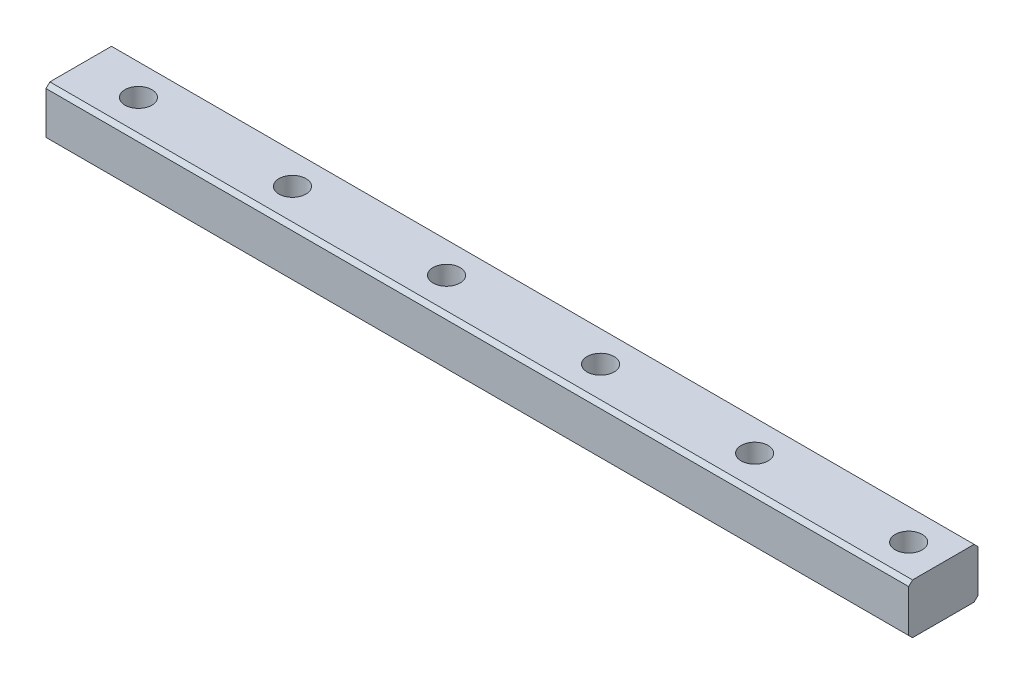
ISO-10303-21;
HEADER;
FILE_DESCRIPTION(('STEP AP214'),'2;1');
FILE_NAME('part.step','',(''),(''),'','','');
FILE_SCHEMA(('AUTOMOTIVE_DESIGN { 1 0 10303 214 1 1 1 1 }'));
ENDSEC;
DATA;
#1=APPLICATION_CONTEXT('core data for automotive mechanical design processes');
#2=APPLICATION_PROTOCOL_DEFINITION('international standard','automotive_design',2000,#1);
#3=PRODUCT_CONTEXT('',#1,'mechanical');
#4=PRODUCT('Part','Part','',(#3));
#5=PRODUCT_RELATED_PRODUCT_CATEGORY('part','',(#4));
#6=PRODUCT_DEFINITION_FORMATION('','',#4);
#7=PRODUCT_DEFINITION_CONTEXT('part definition',#1,'design');
#8=PRODUCT_DEFINITION('design','',#6,#7);
#9=PRODUCT_DEFINITION_SHAPE('','',#8);
#10=(LENGTH_UNIT() NAMED_UNIT(*) SI_UNIT(.MILLI.,.METRE.));
#11=(NAMED_UNIT(*) PLANE_ANGLE_UNIT() SI_UNIT($,.RADIAN.));
#12=(NAMED_UNIT(*) SI_UNIT($,.STERADIAN.) SOLID_ANGLE_UNIT());
#13=UNCERTAINTY_MEASURE_WITH_UNIT(LENGTH_MEASURE(1.E-05),#10,'distance_accuracy_value','');
#14=(GEOMETRIC_REPRESENTATION_CONTEXT(3) GLOBAL_UNCERTAINTY_ASSIGNED_CONTEXT((#13)) GLOBAL_UNIT_ASSIGNED_CONTEXT((#10,
#11,#12)) REPRESENTATION_CONTEXT('',''));
#15=CARTESIAN_POINT('',(0.,0.,0.));
#16=DIRECTION('',(0.,0.,1.));
#17=DIRECTION('',(1.,0.,0.));
#18=AXIS2_PLACEMENT_3D('',#15,#16,#17);
#19=CARTESIAN_POINT('',(107.5,4.75,0.));
#20=DIRECTION('',(0.,-1.,0.));
#21=DIRECTION('',(0.,0.,-1.));
#22=AXIS2_PLACEMENT_3D('',#19,#20,#21);
#23=CYLINDRICAL_SURFACE('',#22,1.75);
#24=CARTESIAN_POINT('',(107.5,3.25,0.));
#25=DIRECTION('',(0.,-1.,0.));
#26=DIRECTION('',(0.,0.,-1.));
#27=AXIS2_PLACEMENT_3D('',#24,#25,#26);
#28=CIRCLE('',#27,1.75);
#29=CARTESIAN_POINT('',(107.5,3.25,-1.75));
#30=VERTEX_POINT('',#29);
#31=EDGE_CURVE('E151',#30,#30,#28,.T.);
#32=ORIENTED_EDGE('',*,*,#31,.F.);
#33=EDGE_LOOP('',(#32));
#34=FACE_BOUND('',#33,.T.);
#35=CARTESIAN_POINT('',(107.5,0.25,0.));
#36=DIRECTION('',(0.,-1.,0.));
#37=DIRECTION('',(0.,0.,-1.));
#38=AXIS2_PLACEMENT_3D('',#35,#36,#37);
#39=CIRCLE('',#38,1.75);
#40=CARTESIAN_POINT('',(107.5,0.25,-1.75));
#41=VERTEX_POINT('',#40);
#42=EDGE_CURVE('E178',#41,#41,#39,.F.);
#43=ORIENTED_EDGE('',*,*,#42,.F.);
#44=EDGE_LOOP('',(#43));
#45=FACE_BOUND('',#44,.T.);
#46=ADVANCED_FACE('F33',(#34,#45),#23,.F.);
#47=CARTESIAN_POINT('',(87.4999999999996,4.75,0.));
#48=DIRECTION('',(0.,-1.,0.));
#49=DIRECTION('',(0.,0.,-1.));
#50=AXIS2_PLACEMENT_3D('',#47,#48,#49);
#51=CYLINDRICAL_SURFACE('',#50,1.75);
#52=CARTESIAN_POINT('',(87.4999999999996,3.25,0.));
#53=DIRECTION('',(0.,-1.,0.));
#54=DIRECTION('',(0.,0.,-1.));
#55=AXIS2_PLACEMENT_3D('',#52,#53,#54);
#56=CIRCLE('',#55,1.75);
#57=CARTESIAN_POINT('',(87.4999999999996,3.25,-1.75));
#58=VERTEX_POINT('',#57);
#59=EDGE_CURVE('E148',#58,#58,#56,.T.);
#60=ORIENTED_EDGE('',*,*,#59,.F.);
#61=EDGE_LOOP('',(#60));
#62=FACE_BOUND('',#61,.T.);
#63=CARTESIAN_POINT('',(87.4999999999996,0.25,0.));
#64=DIRECTION('',(0.,-1.,0.));
#65=DIRECTION('',(0.,0.,-1.));
#66=AXIS2_PLACEMENT_3D('',#63,#64,#65);
#67=CIRCLE('',#66,1.75);
#68=CARTESIAN_POINT('',(87.4999999999996,0.25,-1.75));
#69=VERTEX_POINT('',#68);
#70=EDGE_CURVE('E173',#69,#69,#67,.F.);
#71=ORIENTED_EDGE('',*,*,#70,.F.);
#72=EDGE_LOOP('',(#71));
#73=FACE_BOUND('',#72,.T.);
#74=ADVANCED_FACE('F289',(#62,#73),#51,.F.);
#75=CARTESIAN_POINT('',(67.4999999999997,4.75,0.));
#76=DIRECTION('',(0.,-1.,0.));
#77=DIRECTION('',(0.,0.,-1.));
#78=AXIS2_PLACEMENT_3D('',#75,#76,#77);
#79=CYLINDRICAL_SURFACE('',#78,1.75);
#80=CARTESIAN_POINT('',(67.4999999999997,3.25,0.));
#81=DIRECTION('',(0.,-1.,0.));
#82=DIRECTION('',(0.,0.,-1.));
#83=AXIS2_PLACEMENT_3D('',#80,#81,#82);
#84=CIRCLE('',#83,1.75);
#85=CARTESIAN_POINT('',(67.4999999999997,3.25,-1.75));
#86=VERTEX_POINT('',#85);
#87=EDGE_CURVE('E145',#86,#86,#84,.T.);
#88=ORIENTED_EDGE('',*,*,#87,.F.);
#89=EDGE_LOOP('',(#88));
#90=FACE_BOUND('',#89,.T.);
#91=CARTESIAN_POINT('',(67.4999999999997,0.25,0.));
#92=DIRECTION('',(0.,-1.,0.));
#93=DIRECTION('',(0.,0.,-1.));
#94=AXIS2_PLACEMENT_3D('',#91,#92,#93);
#95=CIRCLE('',#94,1.75);
#96=CARTESIAN_POINT('',(67.4999999999997,0.25,-1.75));
#97=VERTEX_POINT('',#96);
#98=EDGE_CURVE('E168',#97,#97,#95,.F.);
#99=ORIENTED_EDGE('',*,*,#98,.F.);
#100=EDGE_LOOP('',(#99));
#101=FACE_BOUND('',#100,.T.);
#102=ADVANCED_FACE('F294',(#90,#101),#79,.F.);
#103=CARTESIAN_POINT('',(47.4999999999998,4.75,0.));
#104=DIRECTION('',(0.,-1.,0.));
#105=DIRECTION('',(0.,0.,-1.));
#106=AXIS2_PLACEMENT_3D('',#103,#104,#105);
#107=CYLINDRICAL_SURFACE('',#106,1.75);
#108=CARTESIAN_POINT('',(47.4999999999998,3.25,0.));
#109=DIRECTION('',(0.,-1.,0.));
#110=DIRECTION('',(0.,0.,-1.));
#111=AXIS2_PLACEMENT_3D('',#108,#109,#110);
#112=CIRCLE('',#111,1.75);
#113=CARTESIAN_POINT('',(47.4999999999998,3.25,-1.75000000000001));
#114=VERTEX_POINT('',#113);
#115=EDGE_CURVE('E142',#114,#114,#112,.T.);
#116=ORIENTED_EDGE('',*,*,#115,.F.);
#117=EDGE_LOOP('',(#116));
#118=FACE_BOUND('',#117,.T.);
#119=CARTESIAN_POINT('',(47.4999999999998,0.25,0.));
#120=DIRECTION('',(0.,-1.,0.));
#121=DIRECTION('',(0.,0.,-1.));
#122=AXIS2_PLACEMENT_3D('',#119,#120,#121);
#123=CIRCLE('',#122,1.75);
#124=CARTESIAN_POINT('',(47.4999999999998,0.25,-1.75000000000001));
#125=VERTEX_POINT('',#124);
#126=EDGE_CURVE('E163',#125,#125,#123,.F.);
#127=ORIENTED_EDGE('',*,*,#126,.F.);
#128=EDGE_LOOP('',(#127));
#129=FACE_BOUND('',#128,.T.);
#130=ADVANCED_FACE('F302',(#118,#129),#107,.F.);
#131=CARTESIAN_POINT('',(27.4999999999999,4.75,0.));
#132=DIRECTION('',(0.,-1.,0.));
#133=DIRECTION('',(0.,0.,-1.));
#134=AXIS2_PLACEMENT_3D('',#131,#132,#133);
#135=CYLINDRICAL_SURFACE('',#134,1.75);
#136=CARTESIAN_POINT('',(27.4999999999999,3.25,0.));
#137=DIRECTION('',(0.,-1.,0.));
#138=DIRECTION('',(0.,0.,-1.));
#139=AXIS2_PLACEMENT_3D('',#136,#137,#138);
#140=CIRCLE('',#139,1.75);
#141=CARTESIAN_POINT('',(27.4999999999999,3.25,-1.75));
#142=VERTEX_POINT('',#141);
#143=EDGE_CURVE('E139',#142,#142,#140,.T.);
#144=ORIENTED_EDGE('',*,*,#143,.F.);
#145=EDGE_LOOP('',(#144));
#146=FACE_BOUND('',#145,.T.);
#147=CARTESIAN_POINT('',(27.4999999999999,0.25,0.));
#148=DIRECTION('',(0.,-1.,0.));
#149=DIRECTION('',(0.,0.,-1.));
#150=AXIS2_PLACEMENT_3D('',#147,#148,#149);
#151=CIRCLE('',#150,1.75);
#152=CARTESIAN_POINT('',(27.4999999999999,0.25,-1.75));
#153=VERTEX_POINT('',#152);
#154=EDGE_CURVE('E158',#153,#153,#151,.F.);
#155=ORIENTED_EDGE('',*,*,#154,.F.);
#156=EDGE_LOOP('',(#155));
#157=FACE_BOUND('',#156,.T.);
#158=ADVANCED_FACE('F306',(#146,#157),#135,.F.);
#159=CARTESIAN_POINT('',(7.5,4.75,0.));
#160=DIRECTION('',(0.,-1.,0.));
#161=DIRECTION('',(0.,0.,-1.));
#162=AXIS2_PLACEMENT_3D('',#159,#160,#161);
#163=CYLINDRICAL_SURFACE('',#162,1.75);
#164=CARTESIAN_POINT('',(7.5,3.25,0.));
#165=DIRECTION('',(0.,-1.,0.));
#166=DIRECTION('',(0.,0.,-1.));
#167=AXIS2_PLACEMENT_3D('',#164,#165,#166);
#168=CIRCLE('',#167,1.75);
#169=CARTESIAN_POINT('',(7.5,3.25,-1.75));
#170=VERTEX_POINT('',#169);
#171=EDGE_CURVE('E131',#170,#170,#168,.T.);
#172=ORIENTED_EDGE('',*,*,#171,.F.);
#173=EDGE_LOOP('',(#172));
#174=FACE_BOUND('',#173,.T.);
#175=CARTESIAN_POINT('',(7.5,0.25,0.));
#176=DIRECTION('',(0.,-1.,0.));
#177=DIRECTION('',(0.,0.,-1.));
#178=AXIS2_PLACEMENT_3D('',#175,#176,#177);
#179=CIRCLE('',#178,1.75);
#180=CARTESIAN_POINT('',(7.5,0.25,-1.75));
#181=VERTEX_POINT('',#180);
#182=EDGE_CURVE('E154',#181,#181,#179,.F.);
#183=ORIENTED_EDGE('',*,*,#182,.F.);
#184=EDGE_LOOP('',(#183));
#185=FACE_BOUND('',#184,.T.);
#186=ADVANCED_FACE('F310',(#174,#185),#163,.F.);
#187=CARTESIAN_POINT('',(112.,-3.25,4.5));
#188=DIRECTION('',(0.,0.,-1.));
#189=DIRECTION('',(-1.,0.,0.));
#190=AXIS2_PLACEMENT_3D('',#187,#188,#189);
#191=PLANE('',#190);
#192=DIRECTION('',(0.,-1.,0.));
#193=VECTOR('',#192,1.);
#194=CARTESIAN_POINT('',(0.,-3.25,4.5));
#195=LINE('',#194,#193);
#196=CARTESIAN_POINT('',(0.,2.75000000000003,4.5));
#197=VERTEX_POINT('',#196);
#198=CARTESIAN_POINT('',(0.,-2.75,4.5));
#199=VERTEX_POINT('',#198);
#200=EDGE_CURVE('E126',#197,#199,#195,.T.);
#201=ORIENTED_EDGE('',*,*,#200,.T.);
#202=DIRECTION('',(1.,0.,0.));
#203=VECTOR('',#202,1.);
#204=CARTESIAN_POINT('',(112.,-2.75,4.5));
#205=LINE('',#204,#203);
#206=CARTESIAN_POINT('',(112.,-2.75,4.5));
#207=VERTEX_POINT('',#206);
#208=EDGE_CURVE('E104',#199,#207,#205,.T.);
#209=ORIENTED_EDGE('',*,*,#208,.T.);
#210=DIRECTION('',(0.,-1.,0.));
#211=VECTOR('',#210,1.);
#212=CARTESIAN_POINT('',(112.,-3.25,4.5));
#213=LINE('',#212,#211);
#214=CARTESIAN_POINT('',(112.,2.75000000000003,4.5));
#215=VERTEX_POINT('',#214);
#216=EDGE_CURVE('E136',#215,#207,#213,.T.);
#217=ORIENTED_EDGE('',*,*,#216,.F.);
#218=DIRECTION('',(-1.,0.,0.));
#219=VECTOR('',#218,1.);
#220=CARTESIAN_POINT('',(112.,2.75000000000003,4.5));
#221=LINE('',#220,#219);
#222=EDGE_CURVE('E109',#215,#197,#221,.T.);
#223=ORIENTED_EDGE('',*,*,#222,.T.);
#224=EDGE_LOOP('',(#201,#209,#217,#223));
#225=FACE_BOUND('',#224,.T.);
#226=ADVANCED_FACE('F259',(#225),#191,.F.);
#227=CARTESIAN_POINT('',(112.,-3.25,-4.5));
#228=DIRECTION('',(0.,1.,0.));
#229=DIRECTION('',(0.,0.,1.));
#230=AXIS2_PLACEMENT_3D('',#227,#228,#229);
#231=PLANE('',#230);
#232=CARTESIAN_POINT('',(107.5,-3.25,0.));
#233=DIRECTION('',(0.,-1.,0.));
#234=DIRECTION('',(0.,0.,-1.));
#235=AXIS2_PLACEMENT_3D('',#232,#233,#234);
#236=CIRCLE('',#235,2.99999999999999);
#237=CARTESIAN_POINT('',(107.5,-3.25,-2.99999999999999));
#238=VERTEX_POINT('',#237);
#239=EDGE_CURVE('E242',#238,#238,#236,.T.);
#240=ORIENTED_EDGE('',*,*,#239,.F.);
#241=EDGE_LOOP('',(#240));
#242=FACE_BOUND('',#241,.T.);
#243=CARTESIAN_POINT('',(87.5,-3.25,0.));
#244=DIRECTION('',(0.,-1.,0.));
#245=DIRECTION('',(0.,0.,-1.));
#246=AXIS2_PLACEMENT_3D('',#243,#244,#245);
#247=CIRCLE('',#246,3.00000000000001);
#248=CARTESIAN_POINT('',(87.5,-3.25,-3.00000000000001));
#249=VERTEX_POINT('',#248);
#250=EDGE_CURVE('E181',#249,#249,#247,.T.);
#251=ORIENTED_EDGE('',*,*,#250,.F.);
#252=EDGE_LOOP('',(#251));
#253=FACE_BOUND('',#252,.T.);
#254=CARTESIAN_POINT('',(67.5,-3.25,0.));
#255=DIRECTION('',(0.,-1.,0.));
#256=DIRECTION('',(0.,0.,-1.));
#257=AXIS2_PLACEMENT_3D('',#254,#255,#256);
#258=CIRCLE('',#257,2.99999999999999);
#259=CARTESIAN_POINT('',(67.5,-3.25,-2.99999999999999));
#260=VERTEX_POINT('',#259);
#261=EDGE_CURVE('E176',#260,#260,#258,.T.);
#262=ORIENTED_EDGE('',*,*,#261,.F.);
#263=EDGE_LOOP('',(#262));
#264=FACE_BOUND('',#263,.T.);
#265=CARTESIAN_POINT('',(47.5,-3.25,0.));
#266=DIRECTION('',(0.,-1.,0.));
#267=DIRECTION('',(0.,0.,-1.));
#268=AXIS2_PLACEMENT_3D('',#265,#266,#267);
#269=CIRCLE('',#268,3.);
#270=CARTESIAN_POINT('',(47.5,-3.25,-3.));
#271=VERTEX_POINT('',#270);
#272=EDGE_CURVE('E171',#271,#271,#269,.T.);
#273=ORIENTED_EDGE('',*,*,#272,.F.);
#274=EDGE_LOOP('',(#273));
#275=FACE_BOUND('',#274,.T.);
#276=CARTESIAN_POINT('',(27.5,-3.25,0.));
#277=DIRECTION('',(0.,-1.,0.));
#278=DIRECTION('',(0.,0.,-1.));
#279=AXIS2_PLACEMENT_3D('',#276,#277,#278);
#280=CIRCLE('',#279,3.);
#281=CARTESIAN_POINT('',(27.5,-3.25,-3.));
#282=VERTEX_POINT('',#281);
#283=EDGE_CURVE('E166',#282,#282,#280,.T.);
#284=ORIENTED_EDGE('',*,*,#283,.F.);
#285=EDGE_LOOP('',(#284));
#286=FACE_BOUND('',#285,.T.);
#287=CARTESIAN_POINT('',(7.5,-3.25,0.));
#288=DIRECTION('',(0.,-1.,0.));
#289=DIRECTION('',(0.,0.,-1.));
#290=AXIS2_PLACEMENT_3D('',#287,#288,#289);
#291=CIRCLE('',#290,3.);
#292=CARTESIAN_POINT('',(7.5,-3.25,-3.));
#293=VERTEX_POINT('',#292);
#294=EDGE_CURVE('E161',#293,#293,#291,.T.);
#295=ORIENTED_EDGE('',*,*,#294,.F.);
#296=EDGE_LOOP('',(#295));
#297=FACE_BOUND('',#296,.T.);
#298=DIRECTION('',(0.,0.,-1.));
#299=VECTOR('',#298,1.);
#300=CARTESIAN_POINT('',(112.,-3.25,-4.5));
#301=LINE('',#300,#299);
#302=CARTESIAN_POINT('',(112.,-3.25,4.00000000000001));
#303=VERTEX_POINT('',#302);
#304=CARTESIAN_POINT('',(112.,-3.25,-4.));
#305=VERTEX_POINT('',#304);
#306=EDGE_CURVE('E119',#303,#305,#301,.T.);
#307=ORIENTED_EDGE('',*,*,#306,.F.);
#308=DIRECTION('',(-1.,0.,0.));
#309=VECTOR('',#308,1.);
#310=CARTESIAN_POINT('',(112.,-3.25,4.00000000000001));
#311=LINE('',#310,#309);
#312=CARTESIAN_POINT('',(0.,-3.25,4.00000000000001));
#313=VERTEX_POINT('',#312);
#314=EDGE_CURVE('E103',#303,#313,#311,.T.);
#315=ORIENTED_EDGE('',*,*,#314,.T.);
#316=DIRECTION('',(0.,0.,-1.));
#317=VECTOR('',#316,1.);
#318=CARTESIAN_POINT('',(0.,-3.25,-4.5));
#319=LINE('',#318,#317);
#320=CARTESIAN_POINT('',(0.,-3.25,-4.));
#321=VERTEX_POINT('',#320);
#322=EDGE_CURVE('E116',#313,#321,#319,.T.);
#323=ORIENTED_EDGE('',*,*,#322,.T.);
#324=DIRECTION('',(1.,0.,0.));
#325=VECTOR('',#324,1.);
#326=CARTESIAN_POINT('',(112.,-3.25,-4.));
#327=LINE('',#326,#325);
#328=EDGE_CURVE('E121',#321,#305,#327,.T.);
#329=ORIENTED_EDGE('',*,*,#328,.T.);
#330=EDGE_LOOP('',(#307,#315,#323,#329));
#331=FACE_BOUND('',#330,.T.);
#332=ADVANCED_FACE('F115',(#242,#253,#264,#275,#286,#297,#331),#231,.F.);
#333=CARTESIAN_POINT('',(112.,-3.25,-4.5));
#334=DIRECTION('',(0.,0.,1.));
#335=DIRECTION('',(1.,0.,0.));
#336=AXIS2_PLACEMENT_3D('',#333,#334,#335);
#337=PLANE('',#336);
#338=DIRECTION('',(0.,1.,0.));
#339=VECTOR('',#338,1.);
#340=CARTESIAN_POINT('',(0.,-3.25,-4.5));
#341=LINE('',#340,#339);
#342=CARTESIAN_POINT('',(0.,-2.75000000000001,-4.5));
#343=VERTEX_POINT('',#342);
#344=CARTESIAN_POINT('',(0.,2.75,-4.5));
#345=VERTEX_POINT('',#344);
#346=EDGE_CURVE('E125',#343,#345,#341,.T.);
#347=ORIENTED_EDGE('',*,*,#346,.T.);
#348=DIRECTION('',(1.,0.,0.));
#349=VECTOR('',#348,1.);
#350=CARTESIAN_POINT('',(112.,2.75,-4.5));
#351=LINE('',#350,#349);
#352=CARTESIAN_POINT('',(112.,2.75,-4.5));
#353=VERTEX_POINT('',#352);
#354=EDGE_CURVE('E11',#345,#353,#351,.T.);
#355=ORIENTED_EDGE('',*,*,#354,.T.);
#356=DIRECTION('',(0.,1.,0.));
#357=VECTOR('',#356,1.);
#358=CARTESIAN_POINT('',(112.,-3.25,-4.5));
#359=LINE('',#358,#357);
#360=CARTESIAN_POINT('',(112.,-2.75000000000001,-4.5));
#361=VERTEX_POINT('',#360);
#362=EDGE_CURVE('E208',#361,#353,#359,.T.);
#363=ORIENTED_EDGE('',*,*,#362,.F.);
#364=DIRECTION('',(-1.,0.,0.));
#365=VECTOR('',#364,1.);
#366=CARTESIAN_POINT('',(112.,-2.75000000000001,-4.5));
#367=LINE('',#366,#365);
#368=EDGE_CURVE('E41',#361,#343,#367,.T.);
#369=ORIENTED_EDGE('',*,*,#368,.T.);
#370=EDGE_LOOP('',(#347,#355,#363,#369));
#371=FACE_BOUND('',#370,.T.);
#372=ADVANCED_FACE('F206',(#371),#337,.F.);
#373=CARTESIAN_POINT('',(112.,3.25,-4.5));
#374=DIRECTION('',(0.,-1.,0.));
#375=DIRECTION('',(0.,0.,-1.));
#376=AXIS2_PLACEMENT_3D('',#373,#374,#375);
#377=PLANE('',#376);
#378=ORIENTED_EDGE('',*,*,#31,.T.);
#379=EDGE_LOOP('',(#378));
#380=FACE_BOUND('',#379,.T.);
#381=ORIENTED_EDGE('',*,*,#59,.T.);
#382=EDGE_LOOP('',(#381));
#383=FACE_BOUND('',#382,.T.);
#384=ORIENTED_EDGE('',*,*,#87,.T.);
#385=EDGE_LOOP('',(#384));
#386=FACE_BOUND('',#385,.T.);
#387=ORIENTED_EDGE('',*,*,#115,.T.);
#388=EDGE_LOOP('',(#387));
#389=FACE_BOUND('',#388,.T.);
#390=ORIENTED_EDGE('',*,*,#143,.T.);
#391=EDGE_LOOP('',(#390));
#392=FACE_BOUND('',#391,.T.);
#393=ORIENTED_EDGE('',*,*,#171,.T.);
#394=EDGE_LOOP('',(#393));
#395=FACE_BOUND('',#394,.T.);
#396=DIRECTION('',(0.,0.,1.));
#397=VECTOR('',#396,1.);
#398=CARTESIAN_POINT('',(0.,3.25,-4.5));
#399=LINE('',#398,#397);
#400=CARTESIAN_POINT('',(0.,3.25,-4.00000000000001));
#401=VERTEX_POINT('',#400);
#402=CARTESIAN_POINT('',(0.,3.25,4.00000000000003));
#403=VERTEX_POINT('',#402);
#404=EDGE_CURVE('E129',#401,#403,#399,.T.);
#405=ORIENTED_EDGE('',*,*,#404,.T.);
#406=DIRECTION('',(1.,0.,0.));
#407=VECTOR('',#406,1.);
#408=CARTESIAN_POINT('',(112.,3.25,4.00000000000003));
#409=LINE('',#408,#407);
#410=CARTESIAN_POINT('',(112.,3.25,4.00000000000003));
#411=VERTEX_POINT('',#410);
#412=EDGE_CURVE('E48',#403,#411,#409,.T.);
#413=ORIENTED_EDGE('',*,*,#412,.T.);
#414=DIRECTION('',(0.,0.,1.));
#415=VECTOR('',#414,1.);
#416=CARTESIAN_POINT('',(112.,3.25,-4.5));
#417=LINE('',#416,#415);
#418=CARTESIAN_POINT('',(112.,3.25,-4.00000000000001));
#419=VERTEX_POINT('',#418);
#420=EDGE_CURVE('E183',#419,#411,#417,.T.);
#421=ORIENTED_EDGE('',*,*,#420,.F.);
#422=DIRECTION('',(-1.,0.,0.));
#423=VECTOR('',#422,1.);
#424=CARTESIAN_POINT('',(112.,3.25,-4.00000000000001));
#425=LINE('',#424,#423);
#426=EDGE_CURVE('E199',#419,#401,#425,.T.);
#427=ORIENTED_EDGE('',*,*,#426,.T.);
#428=EDGE_LOOP('',(#405,#413,#421,#427));
#429=FACE_BOUND('',#428,.T.);
#430=ADVANCED_FACE('F215',(#380,#383,#386,#389,#392,#395,#429),#377,.F.);
#431=CARTESIAN_POINT('',(112.,3.25,4.5));
#432=DIRECTION('',(1.,0.,0.));
#433=DIRECTION('',(0.,0.,-1.));
#434=AXIS2_PLACEMENT_3D('',#431,#432,#433);
#435=PLANE('',#434);
#436=ORIENTED_EDGE('',*,*,#216,.T.);
#437=DIRECTION('',(0.,0.707106781186557,0.707106781186538));
#438=VECTOR('',#437,1.);
#439=CARTESIAN_POINT('',(112.,0.250000000000082,7.5));
#440=LINE('',#439,#438);
#441=EDGE_CURVE('E197',#207,#303,#440,.F.);
#442=ORIENTED_EDGE('',*,*,#441,.T.);
#443=ORIENTED_EDGE('',*,*,#306,.T.);
#444=DIRECTION('',(0.,-0.707106781186538,0.707106781186557));
#445=VECTOR('',#444,1.);
#446=CARTESIAN_POINT('',(112.,-4.25000000000009,-2.99999999999988));
#447=LINE('',#446,#445);
#448=EDGE_CURVE('E192',#305,#361,#447,.F.);
#449=ORIENTED_EDGE('',*,*,#448,.T.);
#450=ORIENTED_EDGE('',*,*,#362,.T.);
#451=DIRECTION('',(0.,-0.707106781186557,-0.707106781186538));
#452=VECTOR('',#451,1.);
#453=CARTESIAN_POINT('',(112.,7.50000000000001,0.249999999999874));
#454=LINE('',#453,#452);
#455=EDGE_CURVE('E55',#353,#419,#454,.F.);
#456=ORIENTED_EDGE('',*,*,#455,.T.);
#457=ORIENTED_EDGE('',*,*,#420,.T.);
#458=DIRECTION('',(0.,0.707106781186548,-0.707106781186548));
#459=VECTOR('',#458,1.);
#460=CARTESIAN_POINT('',(112.,3.00000000000001,4.25000000000001));
#461=LINE('',#460,#459);
#462=EDGE_CURVE('E195',#411,#215,#461,.F.);
#463=ORIENTED_EDGE('',*,*,#462,.T.);
#464=EDGE_LOOP('',(#436,#442,#443,#449,#450,#456,#457,#463));
#465=FACE_BOUND('',#464,.T.);
#466=ADVANCED_FACE('F315',(#465),#435,.T.);
#467=CARTESIAN_POINT('',(0.,3.25,4.5));
#468=DIRECTION('',(1.,0.,0.));
#469=DIRECTION('',(0.,0.,-1.));
#470=AXIS2_PLACEMENT_3D('',#467,#468,#469);
#471=PLANE('',#470);
#472=ORIENTED_EDGE('',*,*,#322,.F.);
#473=DIRECTION('',(0.,-0.707106781186557,-0.707106781186538));
#474=VECTOR('',#473,1.);
#475=CARTESIAN_POINT('',(0.,-3.25,4.00000000000001));
#476=LINE('',#475,#474);
#477=EDGE_CURVE('E99',#313,#199,#476,.F.);
#478=ORIENTED_EDGE('',*,*,#477,.T.);
#479=ORIENTED_EDGE('',*,*,#200,.F.);
#480=DIRECTION('',(0.,-0.707106781186548,0.707106781186548));
#481=VECTOR('',#480,1.);
#482=CARTESIAN_POINT('',(0.,2.75000000000003,4.5));
#483=LINE('',#482,#481);
#484=EDGE_CURVE('E110',#197,#403,#483,.F.);
#485=ORIENTED_EDGE('',*,*,#484,.T.);
#486=ORIENTED_EDGE('',*,*,#404,.F.);
#487=DIRECTION('',(0.,0.707106781186557,0.707106781186538));
#488=VECTOR('',#487,1.);
#489=CARTESIAN_POINT('',(0.,3.25,-4.00000000000001));
#490=LINE('',#489,#488);
#491=EDGE_CURVE('E186',#401,#345,#490,.F.);
#492=ORIENTED_EDGE('',*,*,#491,.T.);
#493=ORIENTED_EDGE('',*,*,#346,.F.);
#494=DIRECTION('',(0.,0.707106781186538,-0.707106781186557));
#495=VECTOR('',#494,1.);
#496=CARTESIAN_POINT('',(0.,-2.75000000000001,-4.5));
#497=LINE('',#496,#495);
#498=EDGE_CURVE('E120',#343,#321,#497,.F.);
#499=ORIENTED_EDGE('',*,*,#498,.T.);
#500=EDGE_LOOP('',(#472,#478,#479,#485,#486,#492,#493,#499));
#501=FACE_BOUND('',#500,.T.);
#502=ADVANCED_FACE('F123',(#501),#471,.F.);
#503=CARTESIAN_POINT('',(7.5,0.250000000000001,0.));
#504=DIRECTION('',(0.,-1.,0.));
#505=DIRECTION('',(0.,0.,-1.));
#506=AXIS2_PLACEMENT_3D('',#503,#504,#505);
#507=PLANE('',#506);
#508=CARTESIAN_POINT('',(7.5,0.250000000000001,0.));
#509=DIRECTION('',(0.,-1.,0.));
#510=DIRECTION('',(0.,0.,-1.));
#511=AXIS2_PLACEMENT_3D('',#508,#509,#510);
#512=CIRCLE('',#511,3.);
#513=CARTESIAN_POINT('',(7.5,0.25,-3.));
#514=VERTEX_POINT('',#513);
#515=EDGE_CURVE('E157',#514,#514,#512,.T.);
#516=ORIENTED_EDGE('',*,*,#515,.T.);
#517=EDGE_LOOP('',(#516));
#518=FACE_BOUND('',#517,.T.);
#519=ORIENTED_EDGE('',*,*,#182,.T.);
#520=EDGE_LOOP('',(#519));
#521=FACE_BOUND('',#520,.T.);
#522=ADVANCED_FACE('F274',(#518,#521),#507,.T.);
#523=CARTESIAN_POINT('',(7.5,0.250000000000001,0.));
#524=DIRECTION('',(0.,-1.,0.));
#525=DIRECTION('',(0.,0.,-1.));
#526=AXIS2_PLACEMENT_3D('',#523,#524,#525);
#527=CYLINDRICAL_SURFACE('',#526,3.);
#528=ORIENTED_EDGE('',*,*,#515,.F.);
#529=EDGE_LOOP('',(#528));
#530=FACE_BOUND('',#529,.T.);
#531=ORIENTED_EDGE('',*,*,#294,.T.);
#532=EDGE_LOOP('',(#531));
#533=FACE_BOUND('',#532,.T.);
#534=ADVANCED_FACE('F271',(#530,#533),#527,.F.);
#535=CARTESIAN_POINT('',(27.5,0.250000000000001,0.));
#536=DIRECTION('',(0.,-1.,0.));
#537=DIRECTION('',(0.,0.,-1.));
#538=AXIS2_PLACEMENT_3D('',#535,#536,#537);
#539=PLANE('',#538);
#540=CARTESIAN_POINT('',(27.5,0.250000000000001,0.));
#541=DIRECTION('',(0.,-1.,0.));
#542=DIRECTION('',(0.,0.,-1.));
#543=AXIS2_PLACEMENT_3D('',#540,#541,#542);
#544=CIRCLE('',#543,3.);
#545=CARTESIAN_POINT('',(27.5,0.25,-3.));
#546=VERTEX_POINT('',#545);
#547=EDGE_CURVE('E162',#546,#546,#544,.T.);
#548=ORIENTED_EDGE('',*,*,#547,.T.);
#549=EDGE_LOOP('',(#548));
#550=FACE_BOUND('',#549,.T.);
#551=ORIENTED_EDGE('',*,*,#154,.T.);
#552=EDGE_LOOP('',(#551));
#553=FACE_BOUND('',#552,.T.);
#554=ADVANCED_FACE('F273',(#550,#553),#539,.T.);
#555=CARTESIAN_POINT('',(27.5,0.250000000000001,0.));
#556=DIRECTION('',(0.,-1.,0.));
#557=DIRECTION('',(0.,0.,-1.));
#558=AXIS2_PLACEMENT_3D('',#555,#556,#557);
#559=CYLINDRICAL_SURFACE('',#558,3.);
#560=ORIENTED_EDGE('',*,*,#547,.F.);
#561=EDGE_LOOP('',(#560));
#562=FACE_BOUND('',#561,.T.);
#563=ORIENTED_EDGE('',*,*,#283,.T.);
#564=EDGE_LOOP('',(#563));
#565=FACE_BOUND('',#564,.T.);
#566=ADVANCED_FACE('F281',(#562,#565),#559,.F.);
#567=CARTESIAN_POINT('',(47.5,0.250000000000001,0.));
#568=DIRECTION('',(0.,-1.,0.));
#569=DIRECTION('',(0.,0.,-1.));
#570=AXIS2_PLACEMENT_3D('',#567,#568,#569);
#571=PLANE('',#570);
#572=CARTESIAN_POINT('',(47.5,0.250000000000001,0.));
#573=DIRECTION('',(0.,-1.,0.));
#574=DIRECTION('',(0.,0.,-1.));
#575=AXIS2_PLACEMENT_3D('',#572,#573,#574);
#576=CIRCLE('',#575,3.);
#577=CARTESIAN_POINT('',(47.5,0.25,-3.));
#578=VERTEX_POINT('',#577);
#579=EDGE_CURVE('E167',#578,#578,#576,.T.);
#580=ORIENTED_EDGE('',*,*,#579,.T.);
#581=EDGE_LOOP('',(#580));
#582=FACE_BOUND('',#581,.T.);
#583=ORIENTED_EDGE('',*,*,#126,.T.);
#584=EDGE_LOOP('',(#583));
#585=FACE_BOUND('',#584,.T.);
#586=ADVANCED_FACE('F458',(#582,#585),#571,.T.);
#587=CARTESIAN_POINT('',(47.5,0.250000000000001,0.));
#588=DIRECTION('',(0.,-1.,0.));
#589=DIRECTION('',(0.,0.,-1.));
#590=AXIS2_PLACEMENT_3D('',#587,#588,#589);
#591=CYLINDRICAL_SURFACE('',#590,3.);
#592=ORIENTED_EDGE('',*,*,#579,.F.);
#593=EDGE_LOOP('',(#592));
#594=FACE_BOUND('',#593,.T.);
#595=ORIENTED_EDGE('',*,*,#272,.T.);
#596=EDGE_LOOP('',(#595));
#597=FACE_BOUND('',#596,.T.);
#598=ADVANCED_FACE('F448',(#594,#597),#591,.F.);
#599=CARTESIAN_POINT('',(67.5,0.250000000000001,0.));
#600=DIRECTION('',(0.,-1.,0.));
#601=DIRECTION('',(0.,0.,-1.));
#602=AXIS2_PLACEMENT_3D('',#599,#600,#601);
#603=PLANE('',#602);
#604=CARTESIAN_POINT('',(67.5,0.250000000000001,0.));
#605=DIRECTION('',(0.,-1.,0.));
#606=DIRECTION('',(0.,0.,-1.));
#607=AXIS2_PLACEMENT_3D('',#604,#605,#606);
#608=CIRCLE('',#607,2.99999999999999);
#609=CARTESIAN_POINT('',(67.5,0.25,-3.));
#610=VERTEX_POINT('',#609);
#611=EDGE_CURVE('E172',#610,#610,#608,.T.);
#612=ORIENTED_EDGE('',*,*,#611,.T.);
#613=EDGE_LOOP('',(#612));
#614=FACE_BOUND('',#613,.T.);
#615=ORIENTED_EDGE('',*,*,#98,.T.);
#616=EDGE_LOOP('',(#615));
#617=FACE_BOUND('',#616,.T.);
#618=ADVANCED_FACE('F438',(#614,#617),#603,.T.);
#619=CARTESIAN_POINT('',(67.5,0.250000000000001,0.));
#620=DIRECTION('',(0.,-1.,0.));
#621=DIRECTION('',(0.,0.,-1.));
#622=AXIS2_PLACEMENT_3D('',#619,#620,#621);
#623=CYLINDRICAL_SURFACE('',#622,2.99999999999999);
#624=ORIENTED_EDGE('',*,*,#611,.F.);
#625=EDGE_LOOP('',(#624));
#626=FACE_BOUND('',#625,.T.);
#627=ORIENTED_EDGE('',*,*,#261,.T.);
#628=EDGE_LOOP('',(#627));
#629=FACE_BOUND('',#628,.T.);
#630=ADVANCED_FACE('F428',(#626,#629),#623,.F.);
#631=CARTESIAN_POINT('',(87.5,0.250000000000001,0.));
#632=DIRECTION('',(0.,-1.,0.));
#633=DIRECTION('',(0.,0.,-1.));
#634=AXIS2_PLACEMENT_3D('',#631,#632,#633);
#635=PLANE('',#634);
#636=CARTESIAN_POINT('',(87.5,0.250000000000001,0.));
#637=DIRECTION('',(0.,-1.,0.));
#638=DIRECTION('',(0.,0.,-1.));
#639=AXIS2_PLACEMENT_3D('',#636,#637,#638);
#640=CIRCLE('',#639,3.00000000000001);
#641=CARTESIAN_POINT('',(87.5,0.25,-3.00000000000001));
#642=VERTEX_POINT('',#641);
#643=EDGE_CURVE('E177',#642,#642,#640,.T.);
#644=ORIENTED_EDGE('',*,*,#643,.T.);
#645=EDGE_LOOP('',(#644));
#646=FACE_BOUND('',#645,.T.);
#647=ORIENTED_EDGE('',*,*,#70,.T.);
#648=EDGE_LOOP('',(#647));
#649=FACE_BOUND('',#648,.T.);
#650=ADVANCED_FACE('F418',(#646,#649),#635,.T.);
#651=CARTESIAN_POINT('',(87.5,0.250000000000001,0.));
#652=DIRECTION('',(0.,-1.,0.));
#653=DIRECTION('',(0.,0.,-1.));
#654=AXIS2_PLACEMENT_3D('',#651,#652,#653);
#655=CYLINDRICAL_SURFACE('',#654,3.00000000000001);
#656=ORIENTED_EDGE('',*,*,#643,.F.);
#657=EDGE_LOOP('',(#656));
#658=FACE_BOUND('',#657,.T.);
#659=ORIENTED_EDGE('',*,*,#250,.T.);
#660=EDGE_LOOP('',(#659));
#661=FACE_BOUND('',#660,.T.);
#662=ADVANCED_FACE('F409',(#658,#661),#655,.F.);
#663=CARTESIAN_POINT('',(107.5,0.250000000000001,0.));
#664=DIRECTION('',(0.,-1.,0.));
#665=DIRECTION('',(0.,0.,-1.));
#666=AXIS2_PLACEMENT_3D('',#663,#664,#665);
#667=PLANE('',#666);
#668=CARTESIAN_POINT('',(107.5,0.250000000000001,0.));
#669=DIRECTION('',(0.,-1.,0.));
#670=DIRECTION('',(0.,0.,-1.));
#671=AXIS2_PLACEMENT_3D('',#668,#669,#670);
#672=CIRCLE('',#671,2.99999999999999);
#673=CARTESIAN_POINT('',(107.5,0.25,-3.));
#674=VERTEX_POINT('',#673);
#675=EDGE_CURVE('E182',#674,#674,#672,.T.);
#676=ORIENTED_EDGE('',*,*,#675,.T.);
#677=EDGE_LOOP('',(#676));
#678=FACE_BOUND('',#677,.T.);
#679=ORIENTED_EDGE('',*,*,#42,.T.);
#680=EDGE_LOOP('',(#679));
#681=FACE_BOUND('',#680,.T.);
#682=ADVANCED_FACE('F248',(#678,#681),#667,.T.);
#683=CARTESIAN_POINT('',(107.5,0.250000000000001,0.));
#684=DIRECTION('',(0.,-1.,0.));
#685=DIRECTION('',(0.,0.,-1.));
#686=AXIS2_PLACEMENT_3D('',#683,#684,#685);
#687=CYLINDRICAL_SURFACE('',#686,2.99999999999999);
#688=ORIENTED_EDGE('',*,*,#675,.F.);
#689=EDGE_LOOP('',(#688));
#690=FACE_BOUND('',#689,.T.);
#691=ORIENTED_EDGE('',*,*,#239,.T.);
#692=EDGE_LOOP('',(#691));
#693=FACE_BOUND('',#692,.T.);
#694=ADVANCED_FACE('F251',(#690,#693),#687,.F.);
#695=CARTESIAN_POINT('',(112.,-3.25,4.00000000000001));
#696=DIRECTION('',(0.,0.707106781186538,-0.707106781186557));
#697=DIRECTION('',(0.,0.707106781186557,0.707106781186538));
#698=AXIS2_PLACEMENT_3D('',#695,#696,#697);
#699=PLANE('',#698);
#700=ORIENTED_EDGE('',*,*,#441,.F.);
#701=ORIENTED_EDGE('',*,*,#208,.F.);
#702=ORIENTED_EDGE('',*,*,#477,.F.);
#703=ORIENTED_EDGE('',*,*,#314,.F.);
#704=EDGE_LOOP('',(#700,#701,#702,#703));
#705=FACE_BOUND('',#704,.T.);
#706=ADVANCED_FACE('F102',(#705),#699,.F.);
#707=CARTESIAN_POINT('',(112.,2.75000000000003,4.5));
#708=DIRECTION('',(0.,-0.707106781186547,-0.707106781186547));
#709=DIRECTION('',(0.,0.707106781186548,-0.707106781186548));
#710=AXIS2_PLACEMENT_3D('',#707,#708,#709);
#711=PLANE('',#710);
#712=ORIENTED_EDGE('',*,*,#462,.F.);
#713=ORIENTED_EDGE('',*,*,#412,.F.);
#714=ORIENTED_EDGE('',*,*,#484,.F.);
#715=ORIENTED_EDGE('',*,*,#222,.F.);
#716=EDGE_LOOP('',(#712,#713,#714,#715));
#717=FACE_BOUND('',#716,.T.);
#718=ADVANCED_FACE('F330',(#717),#711,.F.);
#719=CARTESIAN_POINT('',(112.,3.25,-4.00000000000001));
#720=DIRECTION('',(0.,-0.707106781186538,0.707106781186557));
#721=DIRECTION('',(0.,-0.707106781186557,-0.707106781186538));
#722=AXIS2_PLACEMENT_3D('',#719,#720,#721);
#723=PLANE('',#722);
#724=ORIENTED_EDGE('',*,*,#455,.F.);
#725=ORIENTED_EDGE('',*,*,#354,.F.);
#726=ORIENTED_EDGE('',*,*,#491,.F.);
#727=ORIENTED_EDGE('',*,*,#426,.F.);
#728=EDGE_LOOP('',(#724,#725,#726,#727));
#729=FACE_BOUND('',#728,.T.);
#730=ADVANCED_FACE('F214',(#729),#723,.F.);
#731=CARTESIAN_POINT('',(112.,-2.75000000000001,-4.5));
#732=DIRECTION('',(0.,0.707106781186557,0.707106781186538));
#733=DIRECTION('',(0.,-0.707106781186538,0.707106781186557));
#734=AXIS2_PLACEMENT_3D('',#731,#732,#733);
#735=PLANE('',#734);
#736=ORIENTED_EDGE('',*,*,#448,.F.);
#737=ORIENTED_EDGE('',*,*,#328,.F.);
#738=ORIENTED_EDGE('',*,*,#498,.F.);
#739=ORIENTED_EDGE('',*,*,#368,.F.);
#740=EDGE_LOOP('',(#736,#737,#738,#739));
#741=FACE_BOUND('',#740,.T.);
#742=ADVANCED_FACE('F35',(#741),#735,.F.);
#743=CLOSED_SHELL('',(#46,#74,#102,#130,#158,#186,#226,#332,#372,#430,#466,#502,#522,#534,#554,
#566,#586,#598,#618,#630,#650,#662,#682,#694,#706,#718,#730,#742));
#744=MANIFOLD_SOLID_BREP('B2',#743);
#745=ADVANCED_BREP_SHAPE_REPRESENTATION('',(#18,#744),#14);
#746=SHAPE_DEFINITION_REPRESENTATION(#9,#745);
ENDSEC;
END-ISO-10303-21;
